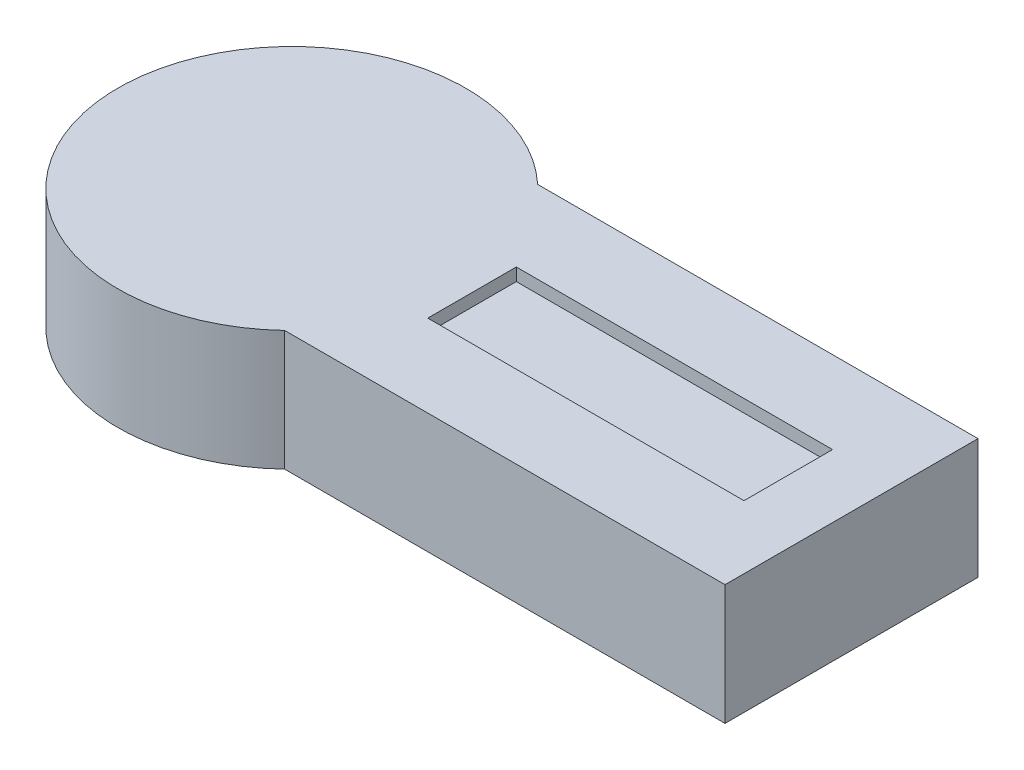
ISO-10303-21;
HEADER;
FILE_DESCRIPTION(('STEP AP214'),'2;1');
FILE_NAME('part.step','',(''),(''),'','','');
FILE_SCHEMA(('AUTOMOTIVE_DESIGN { 1 0 10303 214 1 1 1 1 }'));
ENDSEC;
DATA;
#1=APPLICATION_CONTEXT('core data for automotive mechanical design processes');
#2=APPLICATION_PROTOCOL_DEFINITION('international standard','automotive_design',2000,#1);
#3=PRODUCT_CONTEXT('',#1,'mechanical');
#4=PRODUCT('Part','Part','',(#3));
#5=PRODUCT_RELATED_PRODUCT_CATEGORY('part','',(#4));
#6=PRODUCT_DEFINITION_FORMATION('','',#4);
#7=PRODUCT_DEFINITION_CONTEXT('part definition',#1,'design');
#8=PRODUCT_DEFINITION('design','',#6,#7);
#9=PRODUCT_DEFINITION_SHAPE('','',#8);
#10=(LENGTH_UNIT() NAMED_UNIT(*) SI_UNIT(.MILLI.,.METRE.));
#11=(NAMED_UNIT(*) PLANE_ANGLE_UNIT() SI_UNIT($,.RADIAN.));
#12=(NAMED_UNIT(*) SI_UNIT($,.STERADIAN.) SOLID_ANGLE_UNIT());
#13=UNCERTAINTY_MEASURE_WITH_UNIT(LENGTH_MEASURE(1.E-05),#10,'distance_accuracy_value','');
#14=(GEOMETRIC_REPRESENTATION_CONTEXT(3) GLOBAL_UNCERTAINTY_ASSIGNED_CONTEXT((#13)) GLOBAL_UNIT_ASSIGNED_CONTEXT((#10,
#11,#12)) REPRESENTATION_CONTEXT('',''));
#15=CARTESIAN_POINT('',(0.,0.,0.));
#16=DIRECTION('',(0.,0.,1.));
#17=DIRECTION('',(1.,0.,0.));
#18=AXIS2_PLACEMENT_3D('',#15,#16,#17);
#19=CARTESIAN_POINT('',(0.,9.5,0.));
#20=DIRECTION('',(0.,-1.,0.));
#21=DIRECTION('',(0.,0.,-1.));
#22=AXIS2_PLACEMENT_3D('',#19,#20,#21);
#23=CYLINDRICAL_SURFACE('',#22,13.75);
#24=CARTESIAN_POINT('',(-13.6037678604128,4.5,-2.));
#25=CARTESIAN_POINT('',(-13.6037696828469,4.61170147451788,-1.99999535765154));
#26=CARTESIAN_POINT('',(-13.6051585235321,4.72346876317593,-1.99061045402893));
#27=CARTESIAN_POINT('',(-13.610560390175,4.94388126027463,-1.95332717006911));
#28=CARTESIAN_POINT('',(-13.614576011285,5.05252327013628,-1.9254104806757));
#29=CARTESIAN_POINT('',(-13.6247672106777,5.26346273426917,-1.85191408162582));
#30=CARTESIAN_POINT('',(-13.6309411684424,5.36576488096949,-1.80634762097101));
#31=CARTESIAN_POINT('',(-13.6447514639797,5.56125576556667,-1.69887582800239));
#32=CARTESIAN_POINT('',(-13.6523875909421,5.65444581428902,-1.63697285053976));
#33=CARTESIAN_POINT('',(-13.6683261760088,5.82978470161016,-1.49808684531119));
#34=CARTESIAN_POINT('',(-13.6766327766434,5.91185492507913,-1.42100503184549));
#35=CARTESIAN_POINT('',(-13.692939341013,6.06194363847953,-1.2541626457891));
#36=CARTESIAN_POINT('',(-13.7009392881916,6.12996137057538,-1.16440138984916));
#37=CARTESIAN_POINT('',(-13.715774351691,6.25030296803685,-0.974246137399993));
#38=CARTESIAN_POINT('',(-13.7226040510381,6.30255465914859,-0.873806006100224));
#39=CARTESIAN_POINT('',(-13.7342832774787,6.38941795276065,-0.665459478823011));
#40=CARTESIAN_POINT('',(-13.7391329030898,6.42403043291188,-0.557553454619611));
#41=CARTESIAN_POINT('',(-13.7462763438899,6.47439507307044,-0.338146948151338));
#42=CARTESIAN_POINT('',(-13.7485879705999,6.49027872984307,-0.226677240162864));
#43=CARTESIAN_POINT('',(-13.7504559602361,6.50314299966665,-0.00263235495397366));
#44=CARTESIAN_POINT('',(-13.7500124676143,6.50012460375963,0.109942764000324));
#45=CARTESIAN_POINT('',(-13.7464344541793,6.47537453464448,0.33210621334946));
#46=CARTESIAN_POINT('',(-13.7433202762861,6.45378432135685,0.441710677114492));
#47=CARTESIAN_POINT('',(-13.7347734835498,6.39272535268885,0.655724208207444));
#48=CARTESIAN_POINT('',(-13.7293408119595,6.35325615970269,0.760133148300336));
#49=CARTESIAN_POINT('',(-13.7167324401517,6.25741371072513,0.96122191355512));
#50=CARTESIAN_POINT('',(-13.7095505833803,6.20098057923809,1.05787279927889));
#51=CARTESIAN_POINT('',(-13.6942448666419,6.07285586457755,1.24038631129749));
#52=CARTESIAN_POINT('',(-13.6861209483325,6.00116333615251,1.32624826874212));
#53=CARTESIAN_POINT('',(-13.6697490406875,5.84376603137261,1.48557995150402));
#54=CARTESIAN_POINT('',(-13.6615005987712,5.75793778872673,1.55892771622802));
#55=CARTESIAN_POINT('',(-13.6458827551655,5.57512578282359,1.69019745389173));
#56=CARTESIAN_POINT('',(-13.6385133582954,5.47814195841381,1.74811934226433));
#57=CARTESIAN_POINT('',(-13.6254881867745,5.2756482899756,1.84690774655303));
#58=CARTESIAN_POINT('',(-13.6198336180394,5.17013251177875,1.88776226780075));
#59=CARTESIAN_POINT('',(-13.6109000699534,4.95363666543009,1.95113638111025));
#60=CARTESIAN_POINT('',(-13.6076209336494,4.84265695881666,1.97365718455692));
#61=CARTESIAN_POINT('',(-13.6038391074986,4.61946711009799,1.99955843933569));
#62=CARTESIAN_POINT('',(-13.6033113756213,4.50727741254294,2.00311153325654));
#63=CARTESIAN_POINT('',(-13.6050256766539,4.28390419456715,1.9914341078429));
#64=CARTESIAN_POINT('',(-13.6072676289206,4.1727206449459,1.97620413540482));
#65=CARTESIAN_POINT('',(-13.6142457139645,3.95504724747671,1.92753912095453));
#66=CARTESIAN_POINT('',(-13.6189701240093,3.84853786703674,1.89418961854083));
#67=CARTESIAN_POINT('',(-13.6303711708037,3.6426211915255,1.8103210122416));
#68=CARTESIAN_POINT('',(-13.6370478986438,3.54321422810541,1.75980110720818));
#69=CARTESIAN_POINT('',(-13.6516604770362,3.35354887459301,1.64260909382076));
#70=CARTESIAN_POINT('',(-13.6596049238185,3.2633603872903,1.57582494389196));
#71=CARTESIAN_POINT('',(-13.6758317056166,3.09540964992338,1.42815646147857));
#72=CARTESIAN_POINT('',(-13.6841140585458,3.01764805972209,1.34727138071711));
#73=CARTESIAN_POINT('',(-13.7001614515876,2.87614110931461,1.17293793943112));
#74=CARTESIAN_POINT('',(-13.7079219456001,2.81250997540889,1.0793963812061));
#75=CARTESIAN_POINT('',(-13.7219811196637,2.70186494935789,0.882851777147455));
#76=CARTESIAN_POINT('',(-13.728279837738,2.65485062496658,0.779848977512921));
#77=CARTESIAN_POINT('',(-13.7386857998428,2.57895749320421,0.56766683730455));
#78=CARTESIAN_POINT('',(-13.742800666558,2.55001554129795,0.458510471781478));
#79=CARTESIAN_POINT('',(-13.7484072260598,2.51088413075407,0.236822978136391));
#80=CARTESIAN_POINT('',(-13.7498990813147,2.50069351066479,0.124292059471965));
#81=CARTESIAN_POINT('',(-13.750090067362,2.49938108993855,-0.0998409077402428));
#82=CARTESIAN_POINT('',(-13.7488148327678,2.50808425562927,-0.211441949207725));
#83=CARTESIAN_POINT('',(-13.7436664644928,2.54393804943315,-0.431576028984442));
#84=CARTESIAN_POINT('',(-13.7397933377064,2.57108862859,-0.540109075434818));
#85=CARTESIAN_POINT('',(-13.729882325212,2.64300579441946,-0.750983084659956));
#86=CARTESIAN_POINT('',(-13.7238458410478,2.68776097767429,-0.853328006392713));
#87=CARTESIAN_POINT('',(-13.7102721845596,2.79359839880604,-1.04908313807524));
#88=CARTESIAN_POINT('',(-13.7027349694016,2.85468110272394,-1.14249309288839));
#89=CARTESIAN_POINT('',(-13.6869153274344,2.99207556407474,-1.31861589391602));
#90=CARTESIAN_POINT('',(-13.6786269185731,3.06851678883439,-1.40122721328148));
#91=CARTESIAN_POINT('',(-13.6622840226441,3.23418621462434,-1.55251429750274));
#92=CARTESIAN_POINT('',(-13.6542295910041,3.32341741628073,-1.62118678304171));
#93=CARTESIAN_POINT('',(-13.6392212044936,3.51268413794729,-1.74296896599119));
#94=CARTESIAN_POINT('',(-13.6322732651998,3.61277405500097,-1.79599484512115));
#95=CARTESIAN_POINT('',(-13.6203350006855,3.82049135629695,-1.88440496611452));
#96=CARTESIAN_POINT('',(-13.6153426259364,3.92811070909531,-1.91980768851835));
#97=CARTESIAN_POINT('',(-13.6090457382164,4.11352373508645,-1.96384515631823));
#98=CARTESIAN_POINT('',(-13.6070769015304,4.19016709723434,-1.97738272598923));
#99=CARTESIAN_POINT('',(-13.604437336021,4.34452968570156,-1.99546171045604));
#100=CARTESIAN_POINT('',(-13.6037665918865,4.42224889932032,-2.00000323136023));
#101=CARTESIAN_POINT('',(-13.6037678604128,4.5,-2.));
#102=B_SPLINE_CURVE_WITH_KNOTS('',3,(#24,#25,#26,#27,#28,#29,#30,#31,#32,#33,#34,#35,#36,#37,
#38,#39,#40,#41,#42,#43,#44,#45,#46,#47,#48,#49,#50,#51,#52,#53,#54,#55,#56,#57,#58,#59,#60,#61,
#62,#63,#64,#65,#66,#67,#68,#69,#70,#71,#72,#73,#74,#75,#76,#77,#78,#79,#80,#81,#82,#83,#84,#85,
#86,#87,#88,#89,#90,#91,#92,#93,#94,#95,#96,#97,#98,#99,#100,#101),.UNSPECIFIED.,.T.,.F.,(4,2,2,
2,2,2,2,2,2,2,2,2,2,2,2,2,2,2,2,2,2,2,2,2,2,2,2,2,2,2,2,2,2,2,2,2,2,2,4),(0.,0.334820265461426,
0.669971820365651,1.00487227599159,1.33972448324323,1.67683261336209,2.0139589186132,
2.35260589974262,2.69123602961626,3.02747417523755,3.36369469190866,3.69737669670614,
4.03106686914351,4.36594893825539,4.70085175785745,5.03885209035526,5.37685427578681,
5.7150936056712,6.05331058486375,6.38844382459525,6.7235673066632,7.05712229576479,
7.39069285023057,7.72662975962063,8.06258450119358,8.40116341082857,8.73973351250525,
9.07711393835335,9.41447346625945,9.74872101259897,10.0829676719057,10.4169981778598,
10.7510382191581,11.0880221059806,11.4250851815886,11.7639224096614,12.1024035632571,
12.3354618227144,12.5685173332333),.UNSPECIFIED.);
#103=CARTESIAN_POINT('',(-13.6037678604128,4.5,-2.));
#104=VERTEX_POINT('',#103);
#105=EDGE_CURVE('E52',#104,#104,#102,.T.);
#106=ORIENTED_EDGE('',*,*,#105,.T.);
#107=EDGE_LOOP('',(#106));
#108=FACE_BOUND('',#107,.T.);
#109=CARTESIAN_POINT('',(0.,9.5,0.));
#110=DIRECTION('',(0.,1.,0.));
#111=DIRECTION('',(0.,0.,1.));
#112=AXIS2_PLACEMENT_3D('',#109,#110,#111);
#113=CIRCLE('',#112,13.75);
#114=CARTESIAN_POINT('',(9.43729304408843,9.5,-10.));
#115=VERTEX_POINT('',#114);
#116=CARTESIAN_POINT('',(9.43729304408843,9.5,10.));
#117=VERTEX_POINT('',#116);
#118=EDGE_CURVE('E14',#115,#117,#113,.T.);
#119=ORIENTED_EDGE('',*,*,#118,.F.);
#120=DIRECTION('',(0.,-1.,0.));
#121=VECTOR('',#120,1.);
#122=CARTESIAN_POINT('',(9.43729304408843,9.5,-10.));
#123=LINE('',#122,#121);
#124=CARTESIAN_POINT('',(9.43729304408843,0.,-10.));
#125=VERTEX_POINT('',#124);
#126=EDGE_CURVE('E220',#115,#125,#123,.T.);
#127=ORIENTED_EDGE('',*,*,#126,.T.);
#128=CARTESIAN_POINT('',(0.,0.,0.));
#129=DIRECTION('',(0.,1.,0.));
#130=DIRECTION('',(0.,0.,1.));
#131=AXIS2_PLACEMENT_3D('',#128,#129,#130);
#132=CIRCLE('',#131,13.75);
#133=CARTESIAN_POINT('',(9.43729304408843,0.,10.));
#134=VERTEX_POINT('',#133);
#135=EDGE_CURVE('E60',#125,#134,#132,.T.);
#136=ORIENTED_EDGE('',*,*,#135,.T.);
#137=DIRECTION('',(0.,-1.,0.));
#138=VECTOR('',#137,1.);
#139=CARTESIAN_POINT('',(9.43729304408843,9.5,10.));
#140=LINE('',#139,#138);
#141=EDGE_CURVE('E217',#117,#134,#140,.T.);
#142=ORIENTED_EDGE('',*,*,#141,.F.);
#143=EDGE_LOOP('',(#119,#127,#136,#142));
#144=FACE_BOUND('',#143,.T.);
#145=ADVANCED_FACE('F48',(#108,#144),#23,.T.);
#146=CARTESIAN_POINT('',(0.,9.5,0.));
#147=DIRECTION('',(0.,1.,0.));
#148=DIRECTION('',(0.,0.,1.));
#149=AXIS2_PLACEMENT_3D('',#146,#147,#148);
#150=PLANE('',#149);
#151=DIRECTION('',(0.,0.,1.));
#152=VECTOR('',#151,1.);
#153=CARTESIAN_POINT('',(14.25,9.5,-3.5));
#154=LINE('',#153,#152);
#155=CARTESIAN_POINT('',(14.25,9.5,-3.5));
#156=VERTEX_POINT('',#155);
#157=CARTESIAN_POINT('',(14.25,9.5,3.5));
#158=VERTEX_POINT('',#157);
#159=EDGE_CURVE('E68',#156,#158,#154,.T.);
#160=ORIENTED_EDGE('',*,*,#159,.F.);
#161=DIRECTION('',(1.,0.,0.));
#162=VECTOR('',#161,1.);
#163=CARTESIAN_POINT('',(14.25,9.5,-3.5));
#164=LINE('',#163,#162);
#165=CARTESIAN_POINT('',(39.25,9.5,-3.5));
#166=VERTEX_POINT('',#165);
#167=EDGE_CURVE('E135',#156,#166,#164,.T.);
#168=ORIENTED_EDGE('',*,*,#167,.T.);
#169=DIRECTION('',(0.,0.,1.));
#170=VECTOR('',#169,1.);
#171=CARTESIAN_POINT('',(39.25,9.5,-3.5));
#172=LINE('',#171,#170);
#173=CARTESIAN_POINT('',(39.25,9.5,3.5));
#174=VERTEX_POINT('',#173);
#175=EDGE_CURVE('E138',#166,#174,#172,.T.);
#176=ORIENTED_EDGE('',*,*,#175,.T.);
#177=DIRECTION('',(1.,0.,0.));
#178=VECTOR('',#177,1.);
#179=CARTESIAN_POINT('',(14.25,9.5,3.5));
#180=LINE('',#179,#178);
#181=EDGE_CURVE('E144',#158,#174,#180,.T.);
#182=ORIENTED_EDGE('',*,*,#181,.F.);
#183=EDGE_LOOP('',(#160,#168,#176,#182));
#184=FACE_BOUND('',#183,.T.);
#185=ORIENTED_EDGE('',*,*,#118,.T.);
#186=DIRECTION('',(1.,0.,0.));
#187=VECTOR('',#186,1.);
#188=CARTESIAN_POINT('',(0.,9.5,10.));
#189=LINE('',#188,#187);
#190=CARTESIAN_POINT('',(44.25,9.5,10.));
#191=VERTEX_POINT('',#190);
#192=EDGE_CURVE('E196',#117,#191,#189,.T.);
#193=ORIENTED_EDGE('',*,*,#192,.T.);
#194=DIRECTION('',(0.,0.,1.));
#195=VECTOR('',#194,1.);
#196=CARTESIAN_POINT('',(44.25,9.5,-10.));
#197=LINE('',#196,#195);
#198=CARTESIAN_POINT('',(44.25,9.5,-10.));
#199=VERTEX_POINT('',#198);
#200=EDGE_CURVE('E207',#199,#191,#197,.T.);
#201=ORIENTED_EDGE('',*,*,#200,.F.);
#202=DIRECTION('',(1.,0.,0.));
#203=VECTOR('',#202,1.);
#204=CARTESIAN_POINT('',(0.,9.5,-10.));
#205=LINE('',#204,#203);
#206=EDGE_CURVE('E205',#115,#199,#205,.T.);
#207=ORIENTED_EDGE('',*,*,#206,.F.);
#208=EDGE_LOOP('',(#185,#193,#201,#207));
#209=FACE_BOUND('',#208,.T.);
#210=ADVANCED_FACE('F185',(#184,#209),#150,.T.);
#211=CARTESIAN_POINT('',(0.,0.,0.));
#212=DIRECTION('',(0.,1.,0.));
#213=DIRECTION('',(0.,0.,1.));
#214=AXIS2_PLACEMENT_3D('',#211,#212,#213);
#215=PLANE('',#214);
#216=ORIENTED_EDGE('',*,*,#135,.F.);
#217=DIRECTION('',(1.,0.,0.));
#218=VECTOR('',#217,1.);
#219=CARTESIAN_POINT('',(0.,0.,-10.));
#220=LINE('',#219,#218);
#221=CARTESIAN_POINT('',(44.25,0.,-10.));
#222=VERTEX_POINT('',#221);
#223=EDGE_CURVE('E159',#125,#222,#220,.T.);
#224=ORIENTED_EDGE('',*,*,#223,.T.);
#225=DIRECTION('',(0.,0.,1.));
#226=VECTOR('',#225,1.);
#227=CARTESIAN_POINT('',(44.25,0.,-10.));
#228=LINE('',#227,#226);
#229=CARTESIAN_POINT('',(44.25,0.,10.));
#230=VERTEX_POINT('',#229);
#231=EDGE_CURVE('E202',#222,#230,#228,.T.);
#232=ORIENTED_EDGE('',*,*,#231,.T.);
#233=DIRECTION('',(1.,0.,0.));
#234=VECTOR('',#233,1.);
#235=CARTESIAN_POINT('',(0.,0.,10.));
#236=LINE('',#235,#234);
#237=EDGE_CURVE('E214',#134,#230,#236,.T.);
#238=ORIENTED_EDGE('',*,*,#237,.F.);
#239=EDGE_LOOP('',(#216,#224,#232,#238));
#240=FACE_BOUND('',#239,.T.);
#241=ADVANCED_FACE('F190',(#240),#215,.F.);
#242=CARTESIAN_POINT('',(0.,58.0598857082675,-10.));
#243=DIRECTION('',(0.,0.,-1.));
#244=DIRECTION('',(-1.,0.,0.));
#245=AXIS2_PLACEMENT_3D('',#242,#243,#244);
#246=PLANE('',#245);
#247=ORIENTED_EDGE('',*,*,#126,.F.);
#248=ORIENTED_EDGE('',*,*,#206,.T.);
#249=DIRECTION('',(0.,-1.,0.));
#250=VECTOR('',#249,1.);
#251=CARTESIAN_POINT('',(44.25,58.0598857082675,-10.));
#252=LINE('',#251,#250);
#253=EDGE_CURVE('E211',#199,#222,#252,.T.);
#254=ORIENTED_EDGE('',*,*,#253,.T.);
#255=ORIENTED_EDGE('',*,*,#223,.F.);
#256=EDGE_LOOP('',(#247,#248,#254,#255));
#257=FACE_BOUND('',#256,.T.);
#258=ADVANCED_FACE('F231',(#257),#246,.T.);
#259=CARTESIAN_POINT('',(0.,58.0598857082675,10.));
#260=DIRECTION('',(0.,0.,-1.));
#261=DIRECTION('',(-1.,0.,0.));
#262=AXIS2_PLACEMENT_3D('',#259,#260,#261);
#263=PLANE('',#262);
#264=ORIENTED_EDGE('',*,*,#192,.F.);
#265=ORIENTED_EDGE('',*,*,#141,.T.);
#266=ORIENTED_EDGE('',*,*,#237,.T.);
#267=DIRECTION('',(0.,-1.,0.));
#268=VECTOR('',#267,1.);
#269=CARTESIAN_POINT('',(44.25,58.0598857082675,10.));
#270=LINE('',#269,#268);
#271=EDGE_CURVE('E210',#191,#230,#270,.T.);
#272=ORIENTED_EDGE('',*,*,#271,.F.);
#273=EDGE_LOOP('',(#264,#265,#266,#272));
#274=FACE_BOUND('',#273,.T.);
#275=ADVANCED_FACE('F226',(#274),#263,.F.);
#276=CARTESIAN_POINT('',(44.25,58.0598857082675,-10.));
#277=DIRECTION('',(1.,0.,0.));
#278=DIRECTION('',(0.,0.,-1.));
#279=AXIS2_PLACEMENT_3D('',#276,#277,#278);
#280=PLANE('',#279);
#281=ORIENTED_EDGE('',*,*,#253,.F.);
#282=ORIENTED_EDGE('',*,*,#200,.T.);
#283=ORIENTED_EDGE('',*,*,#271,.T.);
#284=ORIENTED_EDGE('',*,*,#231,.F.);
#285=EDGE_LOOP('',(#281,#282,#283,#284));
#286=FACE_BOUND('',#285,.T.);
#287=ADVANCED_FACE('F234',(#286),#280,.T.);
#288=CARTESIAN_POINT('',(-18.751,4.5,0.));
#289=DIRECTION('',(1.,0.,0.));
#290=DIRECTION('',(0.,0.,-1.));
#291=AXIS2_PLACEMENT_3D('',#288,#289,#290);
#292=CYLINDRICAL_SURFACE('',#291,2.);
#293=CARTESIAN_POINT('',(-16.1264534228701,4.5,-2.));
#294=CARTESIAN_POINT('',(-16.1264550083052,4.38811653582872,-1.99999523491535));
#295=CARTESIAN_POINT('',(-16.1276303449416,4.27616280039642,-1.99057989322956));
#296=CARTESIAN_POINT('',(-16.1322030151056,4.05537002507787,-1.95316853651219));
#297=CARTESIAN_POINT('',(-16.1356026812274,3.94653438024822,-1.92515301552012));
#298=CARTESIAN_POINT('',(-16.1442332388205,3.73520653078661,-1.85137885723158));
#299=CARTESIAN_POINT('',(-16.1494628984566,3.63271011346847,-1.80563215321424));
#300=CARTESIAN_POINT('',(-16.1611627055368,3.43686845212759,-1.69771953981187));
#301=CARTESIAN_POINT('',(-16.1676326379701,3.34352162618651,-1.63555647562323));
#302=CARTESIAN_POINT('',(-16.1811233384656,3.16810269241689,-1.49621407056932));
#303=CARTESIAN_POINT('',(-16.1881466251092,3.08608744319867,-1.4189633860959));
#304=CARTESIAN_POINT('',(-16.2019300204907,2.93615079674028,-1.25179210634181));
#305=CARTESIAN_POINT('',(-16.2086901162137,2.8682300957637,-1.16187088551126));
#306=CARTESIAN_POINT('',(-16.2212111589571,2.74820716099504,-0.971554361813393));
#307=CARTESIAN_POINT('',(-16.2269688356301,2.69615630180599,-0.871126426137084));
#308=CARTESIAN_POINT('',(-16.2368086453089,2.60967960756243,-0.662872163031896));
#309=CARTESIAN_POINT('',(-16.2408908386829,2.57525313748248,-0.555046102324085));
#310=CARTESIAN_POINT('',(-16.2469019957791,2.52517211505083,-0.335637409118634));
#311=CARTESIAN_POINT('',(-16.2488417904769,2.50942310796287,-0.224076637819277));
#312=CARTESIAN_POINT('',(-16.2503865615351,2.49685137868665,0.000120115068125403));
#313=CARTESIAN_POINT('',(-16.2499916270997,2.5000279333997,0.112756055412465));
#314=CARTESIAN_POINT('',(-16.2469202101726,2.52514137715167,0.335263306847503));
#315=CARTESIAN_POINT('',(-16.2442560819133,2.54697668393334,0.445146277603352));
#316=CARTESIAN_POINT('',(-16.2369595234422,2.6086290595095,0.659676242160634));
#317=CARTESIAN_POINT('',(-16.2323270567803,2.6484464613003,0.764323138959459));
#318=CARTESIAN_POINT('',(-16.2215930802597,2.74504106547599,0.965725377056043));
#319=CARTESIAN_POINT('',(-16.2154877634145,2.8018623120261,1.06245938317903));
#320=CARTESIAN_POINT('',(-16.2024913120445,2.9308196240385,1.24505717563188));
#321=CARTESIAN_POINT('',(-16.1956001425833,3.00295637049849,1.33092047832909));
#322=CARTESIAN_POINT('',(-16.1817494756979,3.1610661298691,1.48993615771035));
#323=CARTESIAN_POINT('',(-16.1747898280886,3.24712765878959,1.56300053777561));
#324=CARTESIAN_POINT('',(-16.1616317097586,3.43033970149707,1.69366065698613));
#325=CARTESIAN_POINT('',(-16.1554332412945,3.5274902481567,1.75125635027381));
#326=CARTESIAN_POINT('',(-16.144499313007,3.73020007689047,1.84934873748473));
#327=CARTESIAN_POINT('',(-16.1397644448626,3.83576273803408,1.88983851854619));
#328=CARTESIAN_POINT('',(-16.1323054165133,4.05226014163651,1.95249239952828));
#329=CARTESIAN_POINT('',(-16.1295811624652,4.16319463311354,1.97465735474564));
#330=CARTESIAN_POINT('',(-16.1264688971559,4.38650988889018,1.99991614702911));
#331=CARTESIAN_POINT('',(-16.1260657234509,4.49887644979955,2.00313376066061));
#332=CARTESIAN_POINT('',(-16.1276011748319,4.72254703457505,1.99073299232264));
#333=CARTESIAN_POINT('',(-16.1295397515652,4.83385108033231,1.97511499927328));
#334=CARTESIAN_POINT('',(-16.1355264429296,5.05186704942843,1.92559051661824));
#335=CARTESIAN_POINT('',(-16.1395676564784,5.1585927663608,1.89174384283838));
#336=CARTESIAN_POINT('',(-16.1492986831949,5.36485381497622,1.80678431223724));
#337=CARTESIAN_POINT('',(-16.1549885526072,5.4643889012028,1.75567086634216));
#338=CARTESIAN_POINT('',(-16.1674121389239,5.65400361068549,1.63732390114933));
#339=CARTESIAN_POINT('',(-16.174151054141,5.74403218115088,1.57000913998199));
#340=CARTESIAN_POINT('',(-16.1878970473473,5.91155764338068,1.42128534299878));
#341=CARTESIAN_POINT('',(-16.194904135435,5.98905406264944,1.3398757760105));
#342=CARTESIAN_POINT('',(-16.2084434612257,6.12974951771392,1.16473289592667));
#343=CARTESIAN_POINT('',(-16.2149728641961,6.19286726924281,1.07093403530689));
#344=CARTESIAN_POINT('',(-16.2267788384992,6.3024515337712,0.873994360631562));
#345=CARTESIAN_POINT('',(-16.2320554344221,6.34891837360466,0.770853729991603));
#346=CARTESIAN_POINT('',(-16.2407486649568,6.4237472673842,0.558429554765495));
#347=CARTESIAN_POINT('',(-16.2441701405249,6.45215647665594,0.449162827488097));
#348=CARTESIAN_POINT('',(-16.2487877054915,6.49021712078856,0.227365382034081));
#349=CARTESIAN_POINT('',(-16.2499838920235,6.49986937438688,0.11483480654142));
#350=CARTESIAN_POINT('',(-16.2500156785927,6.50012713853134,-0.109501931532752));
#351=CARTESIAN_POINT('',(-16.2488668212153,6.49085805671002,-0.221307968593219));
#352=CARTESIAN_POINT('',(-16.2443684778583,6.45380164983469,-0.441760504163856));
#353=CARTESIAN_POINT('',(-16.2410189930877,6.42601433495377,-0.550407004409699));
#354=CARTESIAN_POINT('',(-16.2324941241712,6.35274924363819,-0.761441240593303));
#355=CARTESIAN_POINT('',(-16.2273193402137,6.30727728170285,-0.863831020875175));
#356=CARTESIAN_POINT('',(-16.2157171988056,6.19994667273062,-1.05954625191041));
#357=CARTESIAN_POINT('',(-16.2092898283099,6.13808785503045,-1.15287160824718));
#358=CARTESIAN_POINT('',(-16.1958493440343,5.99927485963108,-1.32844975381836));
#359=CARTESIAN_POINT('',(-16.1888327706417,5.92222734027016,-1.41062848590527));
#360=CARTESIAN_POINT('',(-16.1750325956517,5.7554174156885,-1.56093988128044));
#361=CARTESIAN_POINT('',(-16.1682490496844,5.66565200021087,-1.62906920974954));
#362=CARTESIAN_POINT('',(-16.1556558972015,5.47556986672234,-1.74956500030141));
#363=CARTESIAN_POINT('',(-16.1498500338557,5.37521488700036,-1.80187146497581));
#364=CARTESIAN_POINT('',(-16.1399135200178,5.16713084101248,-1.8888154222938));
#365=CARTESIAN_POINT('',(-16.1357810428042,5.05940996661524,-1.92347219261523));
#366=CARTESIAN_POINT('',(-16.1306658953909,4.87593912476245,-1.96580643380904));
#367=CARTESIAN_POINT('',(-16.1290940515084,4.80134786424601,-1.97861066011405));
#368=CARTESIAN_POINT('',(-16.1269872833248,4.65118176103669,-1.99570902232761));
#369=CARTESIAN_POINT('',(-16.1264523514887,4.57560692549532,-2.00000322007728));
#370=CARTESIAN_POINT('',(-16.1264534228701,4.5,-2.));
#371=B_SPLINE_CURVE_WITH_KNOTS('',3,(#293,#294,#295,#296,#297,#298,#299,#300,#301,#302,#303,
#304,#305,#306,#307,#308,#309,#310,#311,#312,#313,#314,#315,#316,#317,#318,#319,#320,#321,#322,
#323,#324,#325,#326,#327,#328,#329,#330,#331,#332,#333,#334,#335,#336,#337,#338,#339,#340,#341,
#342,#343,#344,#345,#346,#347,#348,#349,#350,#351,#352,#353,#354,#355,#356,#357,#358,#359,#360,
#361,#362,#363,#364,#365,#366,#367,#368,#369,#370),.UNSPECIFIED.,.T.,.F.,(4,2,2,2,2,2,2,2,2,2,2,
2,2,2,2,2,2,2,2,2,2,2,2,2,2,2,2,2,2,2,2,2,2,2,2,2,2,2,4),(0.,0.335374196513832,
0.671100655800971,1.00660155876321,1.3420443526076,1.67911350632473,2.01619930712665,
2.35436502685567,2.69251856125728,3.02895460945889,3.36537780335742,3.6999810215811,
4.03459043631322,4.37007418685023,4.70557285766589,5.04329464663325,5.38101743678012,
5.7188765776163,6.05671994825436,6.39235383254361,6.72798078673866,7.06251306150709,
7.39705675034302,7.73331431105555,8.06958454662406,8.40771102414389,8.74583086435328,
9.08306407802911,9.42028257121077,9.75527329092502,10.0902638266106,10.4251443144226,
10.7600282900328,11.0970383208548,11.4341282537992,11.7724807948214,12.1104629772336,
12.3370987570734,12.5637328899785),.UNSPECIFIED.);
#372=CARTESIAN_POINT('',(-16.1264534228701,4.5,-2.));
#373=VERTEX_POINT('',#372);
#374=EDGE_CURVE('E150',#373,#373,#371,.T.);
#375=ORIENTED_EDGE('',*,*,#374,.F.);
#376=EDGE_LOOP('',(#375));
#377=FACE_BOUND('',#376,.T.);
#378=ORIENTED_EDGE('',*,*,#105,.F.);
#379=EDGE_LOOP('',(#378));
#380=FACE_BOUND('',#379,.T.);
#381=ADVANCED_FACE('F161',(#377,#380),#292,.T.);
#382=CARTESIAN_POINT('',(0.,9.5,0.));
#383=DIRECTION('',(0.,-1.,0.));
#384=DIRECTION('',(0.,0.,-1.));
#385=AXIS2_PLACEMENT_3D('',#382,#383,#384);
#386=CYLINDRICAL_SURFACE('',#385,16.25);
#387=ORIENTED_EDGE('',*,*,#374,.T.);
#388=EDGE_LOOP('',(#387));
#389=FACE_BOUND('',#388,.T.);
#390=ADVANCED_FACE('F164',(#389),#386,.T.);
#391=CARTESIAN_POINT('',(14.25,8.5,-3.5));
#392=DIRECTION('',(-1.,0.,0.));
#393=DIRECTION('',(0.,0.,1.));
#394=AXIS2_PLACEMENT_3D('',#391,#392,#393);
#395=PLANE('',#394);
#396=ORIENTED_EDGE('',*,*,#159,.T.);
#397=DIRECTION('',(0.,1.,0.));
#398=VECTOR('',#397,1.);
#399=CARTESIAN_POINT('',(14.25,8.5,3.5));
#400=LINE('',#399,#398);
#401=CARTESIAN_POINT('',(14.25,8.5,3.5));
#402=VERTEX_POINT('',#401);
#403=EDGE_CURVE('E114',#402,#158,#400,.T.);
#404=ORIENTED_EDGE('',*,*,#403,.F.);
#405=DIRECTION('',(0.,0.,1.));
#406=VECTOR('',#405,1.);
#407=CARTESIAN_POINT('',(14.25,8.5,-3.5));
#408=LINE('',#407,#406);
#409=CARTESIAN_POINT('',(14.25,8.5,-3.5));
#410=VERTEX_POINT('',#409);
#411=EDGE_CURVE('E118',#410,#402,#408,.T.);
#412=ORIENTED_EDGE('',*,*,#411,.F.);
#413=DIRECTION('',(0.,1.,0.));
#414=VECTOR('',#413,1.);
#415=CARTESIAN_POINT('',(14.25,8.5,-3.5));
#416=LINE('',#415,#414);
#417=EDGE_CURVE('E148',#410,#156,#416,.T.);
#418=ORIENTED_EDGE('',*,*,#417,.T.);
#419=EDGE_LOOP('',(#396,#404,#412,#418));
#420=FACE_BOUND('',#419,.T.);
#421=ADVANCED_FACE('F116',(#420),#395,.F.);
#422=CARTESIAN_POINT('',(14.25,8.5,-3.5));
#423=DIRECTION('',(0.,0.,1.));
#424=DIRECTION('',(1.,0.,0.));
#425=AXIS2_PLACEMENT_3D('',#422,#423,#424);
#426=PLANE('',#425);
#427=ORIENTED_EDGE('',*,*,#167,.F.);
#428=ORIENTED_EDGE('',*,*,#417,.F.);
#429=DIRECTION('',(1.,0.,0.));
#430=VECTOR('',#429,1.);
#431=CARTESIAN_POINT('',(14.25,8.5,-3.5));
#432=LINE('',#431,#430);
#433=CARTESIAN_POINT('',(39.25,8.5,-3.5));
#434=VERTEX_POINT('',#433);
#435=EDGE_CURVE('E123',#410,#434,#432,.T.);
#436=ORIENTED_EDGE('',*,*,#435,.T.);
#437=DIRECTION('',(0.,1.,0.));
#438=VECTOR('',#437,1.);
#439=CARTESIAN_POINT('',(39.25,8.5,-3.5));
#440=LINE('',#439,#438);
#441=EDGE_CURVE('E151',#434,#166,#440,.T.);
#442=ORIENTED_EDGE('',*,*,#441,.T.);
#443=EDGE_LOOP('',(#427,#428,#436,#442));
#444=FACE_BOUND('',#443,.T.);
#445=ADVANCED_FACE('F171',(#444),#426,.T.);
#446=CARTESIAN_POINT('',(39.25,8.5,-3.5));
#447=DIRECTION('',(-1.,0.,0.));
#448=DIRECTION('',(0.,0.,1.));
#449=AXIS2_PLACEMENT_3D('',#446,#447,#448);
#450=PLANE('',#449);
#451=ORIENTED_EDGE('',*,*,#175,.F.);
#452=ORIENTED_EDGE('',*,*,#441,.F.);
#453=DIRECTION('',(0.,0.,1.));
#454=VECTOR('',#453,1.);
#455=CARTESIAN_POINT('',(39.25,8.5,-3.5));
#456=LINE('',#455,#454);
#457=CARTESIAN_POINT('',(39.25,8.5,3.5));
#458=VERTEX_POINT('',#457);
#459=EDGE_CURVE('E131',#434,#458,#456,.T.);
#460=ORIENTED_EDGE('',*,*,#459,.T.);
#461=DIRECTION('',(0.,1.,0.));
#462=VECTOR('',#461,1.);
#463=CARTESIAN_POINT('',(39.25,8.5,3.5));
#464=LINE('',#463,#462);
#465=EDGE_CURVE('E122',#458,#174,#464,.T.);
#466=ORIENTED_EDGE('',*,*,#465,.T.);
#467=EDGE_LOOP('',(#451,#452,#460,#466));
#468=FACE_BOUND('',#467,.T.);
#469=ADVANCED_FACE('F174',(#468),#450,.T.);
#470=CARTESIAN_POINT('',(14.25,8.5,3.5));
#471=DIRECTION('',(0.,0.,1.));
#472=DIRECTION('',(1.,0.,0.));
#473=AXIS2_PLACEMENT_3D('',#470,#471,#472);
#474=PLANE('',#473);
#475=ORIENTED_EDGE('',*,*,#181,.T.);
#476=ORIENTED_EDGE('',*,*,#465,.F.);
#477=DIRECTION('',(1.,0.,0.));
#478=VECTOR('',#477,1.);
#479=CARTESIAN_POINT('',(14.25,8.5,3.5));
#480=LINE('',#479,#478);
#481=EDGE_CURVE('E127',#402,#458,#480,.T.);
#482=ORIENTED_EDGE('',*,*,#481,.F.);
#483=ORIENTED_EDGE('',*,*,#403,.T.);
#484=EDGE_LOOP('',(#475,#476,#482,#483));
#485=FACE_BOUND('',#484,.T.);
#486=ADVANCED_FACE('F128',(#485),#474,.F.);
#487=CARTESIAN_POINT('',(0.,8.5,0.));
#488=DIRECTION('',(0.,1.,0.));
#489=DIRECTION('',(0.,0.,1.));
#490=AXIS2_PLACEMENT_3D('',#487,#488,#489);
#491=PLANE('',#490);
#492=ORIENTED_EDGE('',*,*,#411,.T.);
#493=ORIENTED_EDGE('',*,*,#481,.T.);
#494=ORIENTED_EDGE('',*,*,#459,.F.);
#495=ORIENTED_EDGE('',*,*,#435,.F.);
#496=EDGE_LOOP('',(#492,#493,#494,#495));
#497=FACE_BOUND('',#496,.T.);
#498=ADVANCED_FACE('F134',(#497),#491,.T.);
#499=CLOSED_SHELL('',(#145,#210,#241,#258,#275,#287,#381,#390,#421,#445,#469,#486,#498));
#500=MANIFOLD_SOLID_BREP('B2',#499);
#501=ADVANCED_BREP_SHAPE_REPRESENTATION('',(#18,#500),#14);
#502=SHAPE_DEFINITION_REPRESENTATION(#9,#501);
ENDSEC;
END-ISO-10303-21;
